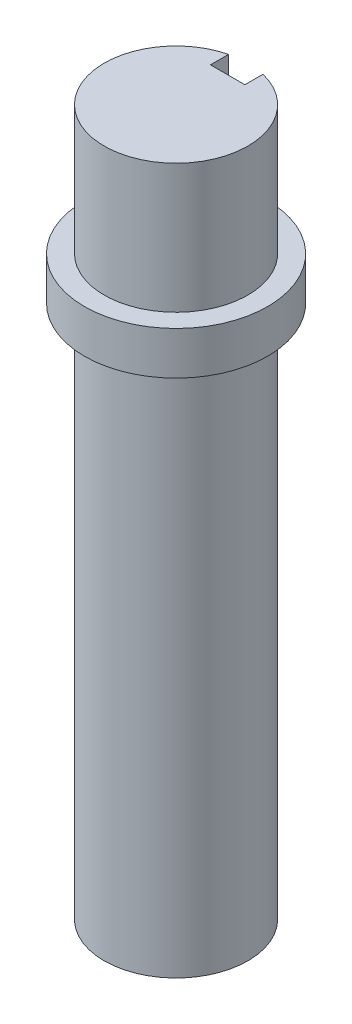
ISO-10303-21;
HEADER;
FILE_DESCRIPTION(('STEP AP214'),'2;1');
FILE_NAME('part.step','',(''),(''),'','','');
FILE_SCHEMA(('AUTOMOTIVE_DESIGN { 1 0 10303 214 1 1 1 1 }'));
ENDSEC;
DATA;
#1=APPLICATION_CONTEXT('core data for automotive mechanical design processes');
#2=APPLICATION_PROTOCOL_DEFINITION('international standard','automotive_design',2000,#1);
#3=PRODUCT_CONTEXT('',#1,'mechanical');
#4=PRODUCT('Part','Part','',(#3));
#5=PRODUCT_RELATED_PRODUCT_CATEGORY('part','',(#4));
#6=PRODUCT_DEFINITION_FORMATION('','',#4);
#7=PRODUCT_DEFINITION_CONTEXT('part definition',#1,'design');
#8=PRODUCT_DEFINITION('design','',#6,#7);
#9=PRODUCT_DEFINITION_SHAPE('','',#8);
#10=(LENGTH_UNIT() NAMED_UNIT(*) SI_UNIT(.MILLI.,.METRE.));
#11=(NAMED_UNIT(*) PLANE_ANGLE_UNIT() SI_UNIT($,.RADIAN.));
#12=(NAMED_UNIT(*) SI_UNIT($,.STERADIAN.) SOLID_ANGLE_UNIT());
#13=UNCERTAINTY_MEASURE_WITH_UNIT(LENGTH_MEASURE(1.E-05),#10,'distance_accuracy_value','');
#14=(GEOMETRIC_REPRESENTATION_CONTEXT(3) GLOBAL_UNCERTAINTY_ASSIGNED_CONTEXT((#13)) GLOBAL_UNIT_ASSIGNED_CONTEXT((#10,
#11,#12)) REPRESENTATION_CONTEXT('',''));
#15=CARTESIAN_POINT('',(0.,0.,0.));
#16=DIRECTION('',(0.,0.,1.));
#17=DIRECTION('',(1.,0.,0.));
#18=AXIS2_PLACEMENT_3D('',#15,#16,#17);
#19=CARTESIAN_POINT('',(0.,82.,0.));
#20=DIRECTION('',(0.,-1.,0.));
#21=DIRECTION('',(0.,0.,-1.));
#22=AXIS2_PLACEMENT_3D('',#19,#20,#21);
#23=CYLINDRICAL_SURFACE('',#22,8.35);
#24=CARTESIAN_POINT('',(0.,67.,0.));
#25=DIRECTION('',(0.,1.,0.));
#26=DIRECTION('',(0.,0.,1.));
#27=AXIS2_PLACEMENT_3D('',#24,#25,#26);
#28=CIRCLE('',#27,8.35);
#29=CARTESIAN_POINT('',(-2.,67.,-8.106941470123));
#30=VERTEX_POINT('',#29);
#31=CARTESIAN_POINT('',(2.,67.,-8.106941470123));
#32=VERTEX_POINT('',#31);
#33=EDGE_CURVE('E44',#30,#32,#28,.T.);
#34=ORIENTED_EDGE('',*,*,#33,.T.);
#35=DIRECTION('',(0.,-1.,0.));
#36=VECTOR('',#35,1.);
#37=CARTESIAN_POINT('',(2.,82.,-8.106941470123));
#38=LINE('',#37,#36);
#39=CARTESIAN_POINT('',(2.,82.,-8.106941470123));
#40=VERTEX_POINT('',#39);
#41=EDGE_CURVE('E113',#32,#40,#38,.F.);
#42=ORIENTED_EDGE('',*,*,#41,.T.);
#43=CARTESIAN_POINT('',(0.,82.,0.));
#44=DIRECTION('',(0.,1.,0.));
#45=DIRECTION('',(0.,0.,1.));
#46=AXIS2_PLACEMENT_3D('',#43,#44,#45);
#47=CIRCLE('',#46,8.35);
#48=CARTESIAN_POINT('',(-2.,82.,-8.106941470123));
#49=VERTEX_POINT('',#48);
#50=EDGE_CURVE('E50',#49,#40,#47,.T.);
#51=ORIENTED_EDGE('',*,*,#50,.F.);
#52=DIRECTION('',(0.,-1.,0.));
#53=VECTOR('',#52,1.);
#54=CARTESIAN_POINT('',(-2.,82.,-8.106941470123));
#55=LINE('',#54,#53);
#56=EDGE_CURVE('E57',#49,#30,#55,.T.);
#57=ORIENTED_EDGE('',*,*,#56,.T.);
#58=EDGE_LOOP('',(#34,#42,#51,#57));
#59=FACE_BOUND('',#58,.T.);
#60=ADVANCED_FACE('F41',(#59),#23,.T.);
#61=CARTESIAN_POINT('',(0.,82.,0.));
#62=DIRECTION('',(0.,1.,0.));
#63=DIRECTION('',(0.,0.,1.));
#64=AXIS2_PLACEMENT_3D('',#61,#62,#63);
#65=PLANE('',#64);
#66=DIRECTION('',(0.,0.,-1.));
#67=VECTOR('',#66,1.);
#68=CARTESIAN_POINT('',(2.,82.,-6.));
#69=LINE('',#68,#67);
#70=CARTESIAN_POINT('',(2.,82.,-6.));
#71=VERTEX_POINT('',#70);
#72=EDGE_CURVE('E65',#71,#40,#69,.T.);
#73=ORIENTED_EDGE('',*,*,#72,.F.);
#74=DIRECTION('',(1.,0.,0.));
#75=VECTOR('',#74,1.);
#76=CARTESIAN_POINT('',(2.,82.,-6.));
#77=LINE('',#76,#75);
#78=CARTESIAN_POINT('',(-2.,82.,-6.));
#79=VERTEX_POINT('',#78);
#80=EDGE_CURVE('E90',#79,#71,#77,.T.);
#81=ORIENTED_EDGE('',*,*,#80,.F.);
#82=DIRECTION('',(0.,0.,1.));
#83=VECTOR('',#82,1.);
#84=CARTESIAN_POINT('',(-2.,82.,-6.));
#85=LINE('',#84,#83);
#86=EDGE_CURVE('E81',#49,#79,#85,.T.);
#87=ORIENTED_EDGE('',*,*,#86,.F.);
#88=ORIENTED_EDGE('',*,*,#50,.T.);
#89=EDGE_LOOP('',(#73,#81,#87,#88));
#90=FACE_BOUND('',#89,.T.);
#91=ADVANCED_FACE('F102',(#90),#65,.T.);
#92=CARTESIAN_POINT('',(0.,67.,0.));
#93=DIRECTION('',(0.,-1.,0.));
#94=DIRECTION('',(0.,0.,-1.));
#95=AXIS2_PLACEMENT_3D('',#92,#93,#94);
#96=CYLINDRICAL_SURFACE('',#95,10.65);
#97=CARTESIAN_POINT('',(0.,67.,0.));
#98=DIRECTION('',(0.,1.,0.));
#99=DIRECTION('',(0.,0.,1.));
#100=AXIS2_PLACEMENT_3D('',#97,#98,#99);
#101=CIRCLE('',#100,10.65);
#102=CARTESIAN_POINT('',(0.,67.,10.65));
#103=VERTEX_POINT('',#102);
#104=EDGE_CURVE('E118',#103,#103,#101,.T.);
#105=ORIENTED_EDGE('',*,*,#104,.F.);
#106=EDGE_LOOP('',(#105));
#107=FACE_BOUND('',#106,.T.);
#108=CARTESIAN_POINT('',(0.,62.,0.));
#109=DIRECTION('',(0.,1.,0.));
#110=DIRECTION('',(0.,0.,1.));
#111=AXIS2_PLACEMENT_3D('',#108,#109,#110);
#112=CIRCLE('',#111,10.65);
#113=CARTESIAN_POINT('',(0.,62.,10.65));
#114=VERTEX_POINT('',#113);
#115=EDGE_CURVE('E117',#114,#114,#112,.T.);
#116=ORIENTED_EDGE('',*,*,#115,.T.);
#117=EDGE_LOOP('',(#116));
#118=FACE_BOUND('',#117,.T.);
#119=ADVANCED_FACE('F174',(#107,#118),#96,.T.);
#120=CARTESIAN_POINT('',(0.,67.,0.));
#121=DIRECTION('',(0.,1.,0.));
#122=DIRECTION('',(0.,0.,1.));
#123=AXIS2_PLACEMENT_3D('',#120,#121,#122);
#124=PLANE('',#123);
#125=ORIENTED_EDGE('',*,*,#104,.T.);
#126=EDGE_LOOP('',(#125));
#127=FACE_BOUND('',#126,.T.);
#128=ORIENTED_EDGE('',*,*,#33,.F.);
#129=DIRECTION('',(0.,0.,-1.));
#130=VECTOR('',#129,1.);
#131=CARTESIAN_POINT('',(-2.,67.,-6.));
#132=LINE('',#131,#130);
#133=CARTESIAN_POINT('',(-2.,67.,-6.));
#134=VERTEX_POINT('',#133);
#135=EDGE_CURVE('E109',#134,#30,#132,.T.);
#136=ORIENTED_EDGE('',*,*,#135,.F.);
#137=DIRECTION('',(-1.,0.,0.));
#138=VECTOR('',#137,1.);
#139=CARTESIAN_POINT('',(2.,67.,-6.));
#140=LINE('',#139,#138);
#141=CARTESIAN_POINT('',(2.,67.,-6.));
#142=VERTEX_POINT('',#141);
#143=EDGE_CURVE('E97',#142,#134,#140,.T.);
#144=ORIENTED_EDGE('',*,*,#143,.F.);
#145=DIRECTION('',(0.,0.,1.));
#146=VECTOR('',#145,1.);
#147=CARTESIAN_POINT('',(2.,67.,-6.));
#148=LINE('',#147,#146);
#149=EDGE_CURVE('E114',#32,#142,#148,.T.);
#150=ORIENTED_EDGE('',*,*,#149,.F.);
#151=EDGE_LOOP('',(#128,#136,#144,#150));
#152=FACE_BOUND('',#151,.T.);
#153=ADVANCED_FACE('F140',(#127,#152),#124,.T.);
#154=CARTESIAN_POINT('',(0.,62.,0.));
#155=DIRECTION('',(0.,1.,0.));
#156=DIRECTION('',(0.,0.,1.));
#157=AXIS2_PLACEMENT_3D('',#154,#155,#156);
#158=PLANE('',#157);
#159=CARTESIAN_POINT('',(0.,62.,0.));
#160=DIRECTION('',(0.,1.,0.));
#161=DIRECTION('',(0.,0.,1.));
#162=AXIS2_PLACEMENT_3D('',#159,#160,#161);
#163=CIRCLE('',#162,8.35);
#164=CARTESIAN_POINT('',(0.,62.,8.35));
#165=VERTEX_POINT('',#164);
#166=EDGE_CURVE('E11',#165,#165,#163,.T.);
#167=ORIENTED_EDGE('',*,*,#166,.T.);
#168=EDGE_LOOP('',(#167));
#169=FACE_BOUND('',#168,.T.);
#170=ORIENTED_EDGE('',*,*,#115,.F.);
#171=EDGE_LOOP('',(#170));
#172=FACE_BOUND('',#171,.T.);
#173=ADVANCED_FACE('F183',(#169,#172),#158,.F.);
#174=CARTESIAN_POINT('',(0.,0.,0.));
#175=DIRECTION('',(0.,1.,0.));
#176=DIRECTION('',(0.,0.,1.));
#177=AXIS2_PLACEMENT_3D('',#174,#175,#176);
#178=PLANE('',#177);
#179=CARTESIAN_POINT('',(0.,0.,0.));
#180=DIRECTION('',(0.,1.,0.));
#181=DIRECTION('',(0.,0.,1.));
#182=AXIS2_PLACEMENT_3D('',#179,#180,#181);
#183=CIRCLE('',#182,8.35);
#184=CARTESIAN_POINT('',(0.,0.,8.35));
#185=VERTEX_POINT('',#184);
#186=EDGE_CURVE('E127',#185,#185,#183,.T.);
#187=ORIENTED_EDGE('',*,*,#186,.F.);
#188=EDGE_LOOP('',(#187));
#189=FACE_BOUND('',#188,.T.);
#190=ADVANCED_FACE('F168',(#189),#178,.F.);
#191=ORIENTED_EDGE('',*,*,#186,.T.);
#192=EDGE_LOOP('',(#191));
#193=FACE_BOUND('',#192,.T.);
#194=ORIENTED_EDGE('',*,*,#166,.F.);
#195=EDGE_LOOP('',(#194));
#196=FACE_BOUND('',#195,.T.);
#197=ADVANCED_FACE('F161',(#193,#196),#23,.T.);
#198=CARTESIAN_POINT('',(2.,57.6577369486808,-6.));
#199=DIRECTION('',(1.,0.,0.));
#200=DIRECTION('',(0.,0.,-1.));
#201=AXIS2_PLACEMENT_3D('',#198,#199,#200);
#202=PLANE('',#201);
#203=ORIENTED_EDGE('',*,*,#149,.T.);
#204=DIRECTION('',(0.,1.,0.));
#205=VECTOR('',#204,1.);
#206=CARTESIAN_POINT('',(2.,57.6577369486808,-6.));
#207=LINE('',#206,#205);
#208=EDGE_CURVE('E100',#142,#71,#207,.T.);
#209=ORIENTED_EDGE('',*,*,#208,.T.);
#210=ORIENTED_EDGE('',*,*,#72,.T.);
#211=ORIENTED_EDGE('',*,*,#41,.F.);
#212=EDGE_LOOP('',(#203,#209,#210,#211));
#213=FACE_BOUND('',#212,.T.);
#214=ADVANCED_FACE('F159',(#213),#202,.F.);
#215=CARTESIAN_POINT('',(-2.,57.6577369486808,-6.));
#216=DIRECTION('',(-1.,0.,0.));
#217=DIRECTION('',(0.,0.,1.));
#218=AXIS2_PLACEMENT_3D('',#215,#216,#217);
#219=PLANE('',#218);
#220=ORIENTED_EDGE('',*,*,#86,.T.);
#221=DIRECTION('',(0.,1.,0.));
#222=VECTOR('',#221,1.);
#223=CARTESIAN_POINT('',(-2.,57.6577369486808,-6.));
#224=LINE('',#223,#222);
#225=EDGE_CURVE('E84',#134,#79,#224,.T.);
#226=ORIENTED_EDGE('',*,*,#225,.F.);
#227=ORIENTED_EDGE('',*,*,#135,.T.);
#228=ORIENTED_EDGE('',*,*,#56,.F.);
#229=EDGE_LOOP('',(#220,#226,#227,#228));
#230=FACE_BOUND('',#229,.T.);
#231=ADVANCED_FACE('F83',(#230),#219,.F.);
#232=CARTESIAN_POINT('',(2.,57.6577369486808,-6.));
#233=DIRECTION('',(0.,0.,1.));
#234=DIRECTION('',(1.,0.,0.));
#235=AXIS2_PLACEMENT_3D('',#232,#233,#234);
#236=PLANE('',#235);
#237=ORIENTED_EDGE('',*,*,#143,.T.);
#238=ORIENTED_EDGE('',*,*,#225,.T.);
#239=ORIENTED_EDGE('',*,*,#80,.T.);
#240=ORIENTED_EDGE('',*,*,#208,.F.);
#241=EDGE_LOOP('',(#237,#238,#239,#240));
#242=FACE_BOUND('',#241,.T.);
#243=ADVANCED_FACE('F94',(#242),#236,.F.);
#244=CLOSED_SHELL('',(#60,#91,#119,#153,#173,#190,#197,#214,#231,#243));
#245=MANIFOLD_SOLID_BREP('B2',#244);
#246=ADVANCED_BREP_SHAPE_REPRESENTATION('',(#18,#245),#14);
#247=SHAPE_DEFINITION_REPRESENTATION(#9,#246);
ENDSEC;
END-ISO-10303-21;
